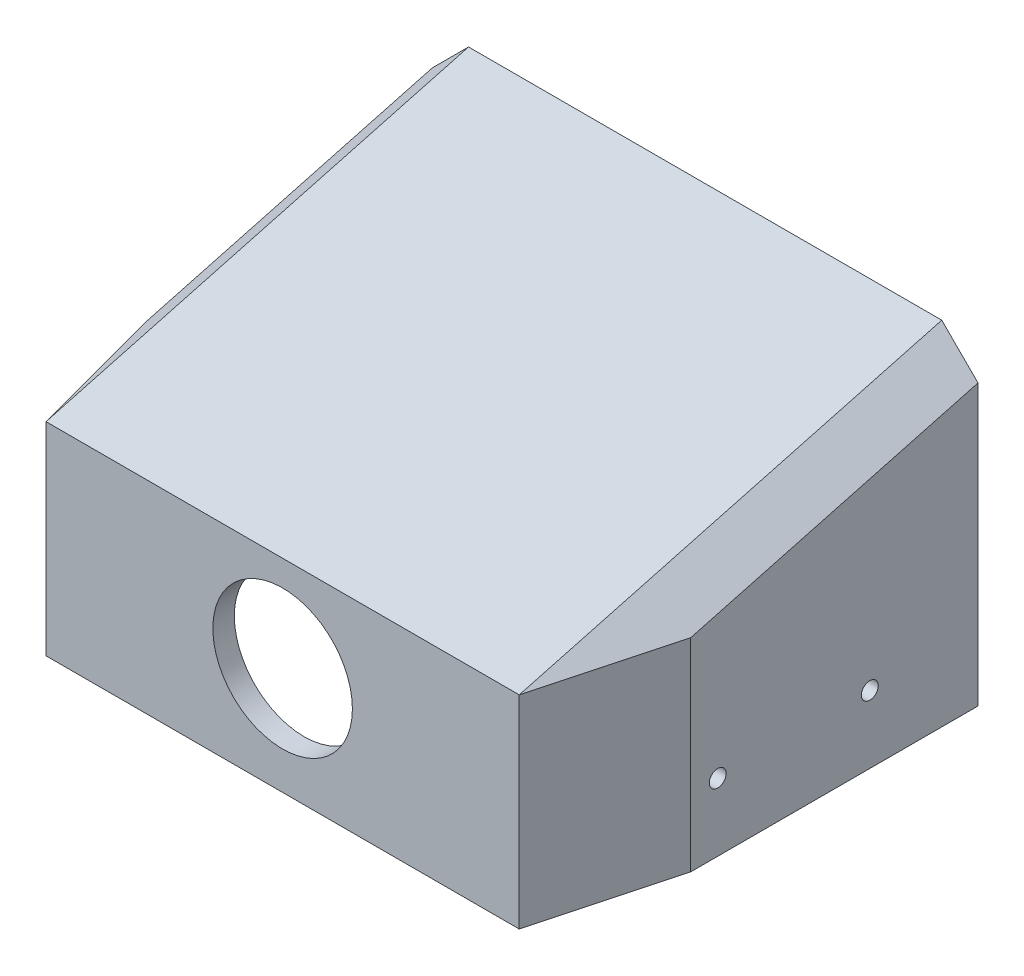
ISO-10303-21;
HEADER;
FILE_DESCRIPTION(('STEP AP214'),'2;1');
FILE_NAME('part.step','',(''),(''),'','','');
FILE_SCHEMA(('AUTOMOTIVE_DESIGN { 1 0 10303 214 1 1 1 1 }'));
ENDSEC;
DATA;
#1=APPLICATION_CONTEXT('core data for automotive mechanical design processes');
#2=APPLICATION_PROTOCOL_DEFINITION('international standard','automotive_design',2000,#1);
#3=PRODUCT_CONTEXT('',#1,'mechanical');
#4=PRODUCT('Part','Part','',(#3));
#5=PRODUCT_RELATED_PRODUCT_CATEGORY('part','',(#4));
#6=PRODUCT_DEFINITION_FORMATION('','',#4);
#7=PRODUCT_DEFINITION_CONTEXT('part definition',#1,'design');
#8=PRODUCT_DEFINITION('design','',#6,#7);
#9=PRODUCT_DEFINITION_SHAPE('','',#8);
#10=(LENGTH_UNIT() NAMED_UNIT(*) SI_UNIT(.MILLI.,.METRE.));
#11=(NAMED_UNIT(*) PLANE_ANGLE_UNIT() SI_UNIT($,.RADIAN.));
#12=(NAMED_UNIT(*) SI_UNIT($,.STERADIAN.) SOLID_ANGLE_UNIT());
#13=UNCERTAINTY_MEASURE_WITH_UNIT(LENGTH_MEASURE(1.E-05),#10,'distance_accuracy_value','');
#14=(GEOMETRIC_REPRESENTATION_CONTEXT(3) GLOBAL_UNCERTAINTY_ASSIGNED_CONTEXT((#13)) GLOBAL_UNIT_ASSIGNED_CONTEXT((#10,
#11,#12)) REPRESENTATION_CONTEXT('',''));
#15=CARTESIAN_POINT('',(0.,0.,0.));
#16=DIRECTION('',(0.,0.,1.));
#17=DIRECTION('',(1.,0.,0.));
#18=AXIS2_PLACEMENT_3D('',#15,#16,#17);
#19=CARTESIAN_POINT('',(103.493649053891,60.,-62.5));
#20=DIRECTION('',(-0.965925826289067,0.,-0.258819045102524));
#21=DIRECTION('',(-0.258819045102524,0.,0.965925826289067));
#22=AXIS2_PLACEMENT_3D('',#19,#20,#21);
#23=PLANE('',#22);
#24=DIRECTION('',(0.258819045102524,0.,-0.965925826289067));
#25=VECTOR('',#24,1.);
#26=CARTESIAN_POINT('',(103.493649053891,0.,-62.5));
#27=LINE('',#26,#25);
#28=CARTESIAN_POINT('',(70.,0.,62.5));
#29=VERTEX_POINT('',#28);
#30=CARTESIAN_POINT('',(80.7179676972451,0.,22.5));
#31=VERTEX_POINT('',#30);
#32=EDGE_CURVE('E225',#29,#31,#27,.T.);
#33=ORIENTED_EDGE('',*,*,#32,.T.);
#34=DIRECTION('',(0.,1.,0.));
#35=VECTOR('',#34,1.);
#36=CARTESIAN_POINT('',(80.7179676972451,0.,22.5));
#37=LINE('',#36,#35);
#38=CARTESIAN_POINT('',(80.7179676972451,60.,22.5));
#39=VERTEX_POINT('',#38);
#40=EDGE_CURVE('E176',#31,#39,#37,.T.);
#41=ORIENTED_EDGE('',*,*,#40,.T.);
#42=DIRECTION('',(0.258819045102524,0.,-0.965925826289067));
#43=VECTOR('',#42,1.);
#44=CARTESIAN_POINT('',(103.493649053891,60.,-62.5));
#45=LINE('',#44,#43);
#46=CARTESIAN_POINT('',(70.,60.,62.5));
#47=VERTEX_POINT('',#46);
#48=EDGE_CURVE('E226',#47,#39,#45,.T.);
#49=ORIENTED_EDGE('',*,*,#48,.F.);
#50=DIRECTION('',(0.,-1.,0.));
#51=VECTOR('',#50,1.);
#52=CARTESIAN_POINT('',(70.,60.,62.5));
#53=LINE('',#52,#51);
#54=EDGE_CURVE('E235',#47,#29,#53,.T.);
#55=ORIENTED_EDGE('',*,*,#54,.T.);
#56=EDGE_LOOP('',(#33,#41,#49,#55));
#57=FACE_BOUND('',#56,.T.);
#58=ADVANCED_FACE('F37',(#57),#23,.F.);
#59=CARTESIAN_POINT('',(-103.493649053891,60.,-62.5));
#60=DIRECTION('',(0.,0.,1.));
#61=DIRECTION('',(1.,0.,0.));
#62=AXIS2_PLACEMENT_3D('',#59,#60,#61);
#63=PLANE('',#62);
#64=CARTESIAN_POINT('',(0.,31.75,-62.5));
#65=DIRECTION('',(0.,0.,-1.));
#66=DIRECTION('',(-1.,0.,0.));
#67=AXIS2_PLACEMENT_3D('',#64,#65,#66);
#68=CIRCLE('',#67,20.64);
#69=CARTESIAN_POINT('',(-20.64,31.75,-62.5));
#70=VERTEX_POINT('',#69);
#71=EDGE_CURVE('E252',#70,#70,#68,.T.);
#72=ORIENTED_EDGE('',*,*,#71,.F.);
#73=EDGE_LOOP('',(#72));
#74=FACE_BOUND('',#73,.T.);
#75=DIRECTION('',(-1.,0.,0.));
#76=VECTOR('',#75,1.);
#77=CARTESIAN_POINT('',(-103.493649053891,0.,-62.5));
#78=LINE('',#77,#76);
#79=CARTESIAN_POINT('',(80.7179676972451,0.,-62.5));
#80=VERTEX_POINT('',#79);
#81=CARTESIAN_POINT('',(-80.7179676972451,0.,-62.5));
#82=VERTEX_POINT('',#81);
#83=EDGE_CURVE('E238',#80,#82,#78,.T.);
#84=ORIENTED_EDGE('',*,*,#83,.T.);
#85=DIRECTION('',(0.,1.,0.));
#86=VECTOR('',#85,1.);
#87=CARTESIAN_POINT('',(-80.7179676972451,60.,-62.5));
#88=LINE('',#87,#86);
#89=CARTESIAN_POINT('',(-80.7179676972451,82.7756813566449,-62.5));
#90=VERTEX_POINT('',#89);
#91=EDGE_CURVE('E205',#82,#90,#88,.T.);
#92=ORIENTED_EDGE('',*,*,#91,.T.);
#93=DIRECTION('',(0.707106781186562,0.707106781186533,0.));
#94=VECTOR('',#93,1.);
#95=CARTESIAN_POINT('',(-103.493649053891,60.,-62.5));
#96=LINE('',#95,#94);
#97=CARTESIAN_POINT('',(-70.,93.4936490538895,-62.5));
#98=VERTEX_POINT('',#97);
#99=EDGE_CURVE('E212',#90,#98,#96,.T.);
#100=ORIENTED_EDGE('',*,*,#99,.T.);
#101=DIRECTION('',(-1.,0.,0.));
#102=VECTOR('',#101,1.);
#103=CARTESIAN_POINT('',(70.,93.4936490538895,-62.5));
#104=LINE('',#103,#102);
#105=CARTESIAN_POINT('',(70.,93.4936490538895,-62.4999999999999));
#106=VERTEX_POINT('',#105);
#107=EDGE_CURVE('E222',#106,#98,#104,.T.);
#108=ORIENTED_EDGE('',*,*,#107,.F.);
#109=DIRECTION('',(0.707106781186562,-0.707106781186533,0.));
#110=VECTOR('',#109,1.);
#111=CARTESIAN_POINT('',(103.493649053891,60.,-62.5));
#112=LINE('',#111,#110);
#113=CARTESIAN_POINT('',(80.7179676972451,82.7756813566448,-62.5));
#114=VERTEX_POINT('',#113);
#115=EDGE_CURVE('E214',#106,#114,#112,.T.);
#116=ORIENTED_EDGE('',*,*,#115,.T.);
#117=DIRECTION('',(0.,-1.,0.));
#118=VECTOR('',#117,1.);
#119=CARTESIAN_POINT('',(80.7179676972451,60.,-62.5));
#120=LINE('',#119,#118);
#121=EDGE_CURVE('E60',#114,#80,#120,.T.);
#122=ORIENTED_EDGE('',*,*,#121,.T.);
#123=EDGE_LOOP('',(#84,#92,#100,#108,#116,#122));
#124=FACE_BOUND('',#123,.T.);
#125=ADVANCED_FACE('F338',(#74,#124),#63,.F.);
#126=CARTESIAN_POINT('',(-103.493649053891,60.,-62.5));
#127=DIRECTION('',(0.965925826289067,0.,-0.258819045102524));
#128=DIRECTION('',(-0.258819045102524,0.,-0.965925826289067));
#129=AXIS2_PLACEMENT_3D('',#126,#127,#128);
#130=PLANE('',#129);
#131=DIRECTION('',(0.258819045102524,0.,0.965925826289067));
#132=VECTOR('',#131,1.);
#133=CARTESIAN_POINT('',(-103.493649053891,60.,-62.5));
#134=LINE('',#133,#132);
#135=CARTESIAN_POINT('',(-80.7179676972451,60.,22.5000000000001));
#136=VERTEX_POINT('',#135);
#137=CARTESIAN_POINT('',(-70.,60.,62.5));
#138=VERTEX_POINT('',#137);
#139=EDGE_CURVE('E229',#136,#138,#134,.T.);
#140=ORIENTED_EDGE('',*,*,#139,.F.);
#141=DIRECTION('',(0.,1.,0.));
#142=VECTOR('',#141,1.);
#143=CARTESIAN_POINT('',(-80.7179676972451,0.,22.5));
#144=LINE('',#143,#142);
#145=CARTESIAN_POINT('',(-80.7179676972451,0.,22.5));
#146=VERTEX_POINT('',#145);
#147=EDGE_CURVE('E204',#146,#136,#144,.T.);
#148=ORIENTED_EDGE('',*,*,#147,.F.);
#149=DIRECTION('',(0.258819045102524,0.,0.965925826289067));
#150=VECTOR('',#149,1.);
#151=CARTESIAN_POINT('',(-103.493649053891,0.,-62.5));
#152=LINE('',#151,#150);
#153=CARTESIAN_POINT('',(-70.,0.,62.5));
#154=VERTEX_POINT('',#153);
#155=EDGE_CURVE('E241',#146,#154,#152,.T.);
#156=ORIENTED_EDGE('',*,*,#155,.T.);
#157=DIRECTION('',(0.,-1.,0.));
#158=VECTOR('',#157,1.);
#159=CARTESIAN_POINT('',(-70.,60.,62.5));
#160=LINE('',#159,#158);
#161=EDGE_CURVE('E246',#138,#154,#160,.T.);
#162=ORIENTED_EDGE('',*,*,#161,.F.);
#163=EDGE_LOOP('',(#140,#148,#156,#162));
#164=FACE_BOUND('',#163,.T.);
#165=ADVANCED_FACE('F343',(#164),#130,.F.);
#166=CARTESIAN_POINT('',(70.,60.,62.5));
#167=DIRECTION('',(0.,0.,-1.));
#168=DIRECTION('',(-1.,0.,0.));
#169=AXIS2_PLACEMENT_3D('',#166,#167,#168);
#170=PLANE('',#169);
#171=CARTESIAN_POINT('',(0.,31.75,62.5));
#172=DIRECTION('',(0.,0.,1.));
#173=DIRECTION('',(1.,0.,0.));
#174=AXIS2_PLACEMENT_3D('',#171,#172,#173);
#175=CIRCLE('',#174,20.64);
#176=CARTESIAN_POINT('',(20.64,31.75,62.5));
#177=VERTEX_POINT('',#176);
#178=EDGE_CURVE('E255',#177,#177,#175,.T.);
#179=ORIENTED_EDGE('',*,*,#178,.F.);
#180=EDGE_LOOP('',(#179));
#181=FACE_BOUND('',#180,.T.);
#182=DIRECTION('',(1.,0.,0.));
#183=VECTOR('',#182,1.);
#184=CARTESIAN_POINT('',(70.,0.,62.5));
#185=LINE('',#184,#183);
#186=EDGE_CURVE('E230',#154,#29,#185,.T.);
#187=ORIENTED_EDGE('',*,*,#186,.T.);
#188=ORIENTED_EDGE('',*,*,#54,.F.);
#189=DIRECTION('',(1.,0.,0.));
#190=VECTOR('',#189,1.);
#191=CARTESIAN_POINT('',(70.,60.,62.5));
#192=LINE('',#191,#190);
#193=EDGE_CURVE('E232',#138,#47,#192,.T.);
#194=ORIENTED_EDGE('',*,*,#193,.F.);
#195=ORIENTED_EDGE('',*,*,#161,.T.);
#196=EDGE_LOOP('',(#187,#188,#194,#195));
#197=FACE_BOUND('',#196,.T.);
#198=ADVANCED_FACE('F362',(#181,#197),#170,.F.);
#199=CARTESIAN_POINT('',(0.,0.,0.));
#200=DIRECTION('',(0.,-1.,0.));
#201=DIRECTION('',(0.,0.,-1.));
#202=AXIS2_PLACEMENT_3D('',#199,#200,#201);
#203=PLANE('',#202);
#204=DIRECTION('',(0.,0.,-1.));
#205=VECTOR('',#204,1.);
#206=CARTESIAN_POINT('',(-74.3679676972451,0.,22.5));
#207=LINE('',#206,#205);
#208=CARTESIAN_POINT('',(-74.3679676972451,0.,21.6640066403199));
#209=VERTEX_POINT('',#208);
#210=CARTESIAN_POINT('',(-74.3679676972451,0.,-56.15));
#211=VERTEX_POINT('',#210);
#212=EDGE_CURVE('E190',#209,#211,#207,.T.);
#213=ORIENTED_EDGE('',*,*,#212,.F.);
#214=DIRECTION('',(0.258819045102524,0.,0.965925826289067));
#215=VECTOR('',#214,1.);
#216=CARTESIAN_POINT('',(-74.8022601355199,0.,20.0432051953356));
#217=LINE('',#216,#215);
#218=CARTESIAN_POINT('',(-65.1274736263336,0.,56.15));
#219=VERTEX_POINT('',#218);
#220=EDGE_CURVE('E187',#209,#219,#217,.T.);
#221=ORIENTED_EDGE('',*,*,#220,.T.);
#222=DIRECTION('',(1.,0.,0.));
#223=VECTOR('',#222,1.);
#224=CARTESIAN_POINT('',(0.,0.,56.15));
#225=LINE('',#224,#223);
#226=CARTESIAN_POINT('',(65.1274736263336,0.,56.15));
#227=VERTEX_POINT('',#226);
#228=EDGE_CURVE('E53',#219,#227,#225,.T.);
#229=ORIENTED_EDGE('',*,*,#228,.T.);
#230=DIRECTION('',(0.258819045102524,0.,-0.965925826289067));
#231=VECTOR('',#230,1.);
#232=CARTESIAN_POINT('',(74.8022601355199,0.,20.0432051953356));
#233=LINE('',#232,#231);
#234=CARTESIAN_POINT('',(74.3679676972451,0.,21.6640066403199));
#235=VERTEX_POINT('',#234);
#236=EDGE_CURVE('E182',#227,#235,#233,.T.);
#237=ORIENTED_EDGE('',*,*,#236,.T.);
#238=DIRECTION('',(0.,0.,1.));
#239=VECTOR('',#238,1.);
#240=CARTESIAN_POINT('',(74.3679676972451,0.,22.5));
#241=LINE('',#240,#239);
#242=CARTESIAN_POINT('',(74.3679676972451,0.,-56.15));
#243=VERTEX_POINT('',#242);
#244=EDGE_CURVE('E197',#243,#235,#241,.T.);
#245=ORIENTED_EDGE('',*,*,#244,.F.);
#246=DIRECTION('',(-1.,0.,0.));
#247=VECTOR('',#246,1.);
#248=CARTESIAN_POINT('',(0.,0.,-56.15));
#249=LINE('',#248,#247);
#250=EDGE_CURVE('E185',#243,#211,#249,.T.);
#251=ORIENTED_EDGE('',*,*,#250,.T.);
#252=EDGE_LOOP('',(#213,#221,#229,#237,#245,#251));
#253=FACE_BOUND('',#252,.T.);
#254=DIRECTION('',(0.,0.,-1.));
#255=VECTOR('',#254,1.);
#256=CARTESIAN_POINT('',(-80.7179676972451,0.,22.5));
#257=LINE('',#256,#255);
#258=EDGE_CURVE('E201',#146,#82,#257,.T.);
#259=ORIENTED_EDGE('',*,*,#258,.T.);
#260=ORIENTED_EDGE('',*,*,#83,.F.);
#261=DIRECTION('',(0.,0.,1.));
#262=VECTOR('',#261,1.);
#263=CARTESIAN_POINT('',(80.7179676972451,0.,22.5));
#264=LINE('',#263,#262);
#265=EDGE_CURVE('E172',#80,#31,#264,.T.);
#266=ORIENTED_EDGE('',*,*,#265,.T.);
#267=ORIENTED_EDGE('',*,*,#32,.F.);
#268=ORIENTED_EDGE('',*,*,#186,.F.);
#269=ORIENTED_EDGE('',*,*,#155,.F.);
#270=EDGE_LOOP('',(#259,#260,#266,#267,#268,#269));
#271=FACE_BOUND('',#270,.T.);
#272=ADVANCED_FACE('F321',(#253,#271),#203,.T.);
#273=CARTESIAN_POINT('',(70.,60.,62.5));
#274=DIRECTION('',(0.,-0.96592582628907,-0.258819045102515));
#275=DIRECTION('',(0.,0.258819045102515,-0.96592582628907));
#276=AXIS2_PLACEMENT_3D('',#273,#274,#275);
#277=PLANE('',#276);
#278=ORIENTED_EDGE('',*,*,#107,.T.);
#279=DIRECTION('',(0.,-0.258819045102515,0.96592582628907));
#280=VECTOR('',#279,1.);
#281=CARTESIAN_POINT('',(-70.,60.,62.5));
#282=LINE('',#281,#280);
#283=EDGE_CURVE('E217',#98,#138,#282,.T.);
#284=ORIENTED_EDGE('',*,*,#283,.T.);
#285=ORIENTED_EDGE('',*,*,#193,.T.);
#286=DIRECTION('',(0.,-0.258819045102515,0.96592582628907));
#287=VECTOR('',#286,1.);
#288=CARTESIAN_POINT('',(70.,60.,62.5));
#289=LINE('',#288,#287);
#290=EDGE_CURVE('E220',#106,#47,#289,.T.);
#291=ORIENTED_EDGE('',*,*,#290,.F.);
#292=EDGE_LOOP('',(#278,#284,#285,#291));
#293=FACE_BOUND('',#292,.T.);
#294=ADVANCED_FACE('F358',(#293),#277,.F.);
#295=CARTESIAN_POINT('',(70.8307043776579,70.8307043776608,18.9790300373213));
#296=DIRECTION('',(0.694746590606852,0.69474659060688,0.186156787897385));
#297=DIRECTION('',(-0.707106781186562,0.707106781186533,0.));
#298=AXIS2_PLACEMENT_3D('',#295,#296,#297);
#299=PLANE('',#298);
#300=DIRECTION('',(0.,-0.258819045102515,0.96592582628907));
#301=VECTOR('',#300,1.);
#302=CARTESIAN_POINT('',(80.7179676972451,61.6057621135332,16.5072142074247));
#303=LINE('',#302,#301);
#304=EDGE_CURVE('E11',#114,#39,#303,.T.);
#305=ORIENTED_EDGE('',*,*,#304,.F.);
#306=ORIENTED_EDGE('',*,*,#115,.F.);
#307=ORIENTED_EDGE('',*,*,#290,.T.);
#308=ORIENTED_EDGE('',*,*,#48,.T.);
#309=EDGE_LOOP('',(#305,#306,#307,#308));
#310=FACE_BOUND('',#309,.T.);
#311=ADVANCED_FACE('F356',(#310),#299,.T.);
#312=CARTESIAN_POINT('',(-70.8307043776579,70.8307043776608,18.9790300373213));
#313=DIRECTION('',(-0.694746590606852,0.69474659060688,0.186156787897385));
#314=DIRECTION('',(-0.707106781186562,-0.707106781186533,0.));
#315=AXIS2_PLACEMENT_3D('',#312,#313,#314);
#316=PLANE('',#315);
#317=DIRECTION('',(0.,0.258819045102515,-0.96592582628907));
#318=VECTOR('',#317,1.);
#319=CARTESIAN_POINT('',(-80.7179676972451,61.6057621135333,16.5072142074247));
#320=LINE('',#319,#318);
#321=EDGE_CURVE('E45',#136,#90,#320,.T.);
#322=ORIENTED_EDGE('',*,*,#321,.F.);
#323=ORIENTED_EDGE('',*,*,#139,.T.);
#324=ORIENTED_EDGE('',*,*,#283,.F.);
#325=ORIENTED_EDGE('',*,*,#99,.F.);
#326=EDGE_LOOP('',(#322,#323,#324,#325));
#327=FACE_BOUND('',#326,.T.);
#328=ADVANCED_FACE('F372',(#327),#316,.T.);
#329=CARTESIAN_POINT('',(-80.7179676972451,0.,22.5));
#330=DIRECTION('',(1.,0.,0.));
#331=DIRECTION('',(0.,0.,-1.));
#332=AXIS2_PLACEMENT_3D('',#329,#330,#331);
#333=PLANE('',#332);
#334=CARTESIAN_POINT('',(-80.7179676972451,20.,14.5));
#335=DIRECTION('',(1.,0.,0.));
#336=DIRECTION('',(0.,0.,-1.));
#337=AXIS2_PLACEMENT_3D('',#334,#335,#336);
#338=CIRCLE('',#337,2.5);
#339=CARTESIAN_POINT('',(-80.7179676972451,20.,12.));
#340=VERTEX_POINT('',#339);
#341=EDGE_CURVE('E259',#340,#340,#338,.T.);
#342=ORIENTED_EDGE('',*,*,#341,.T.);
#343=EDGE_LOOP('',(#342));
#344=FACE_BOUND('',#343,.T.);
#345=CARTESIAN_POINT('',(-80.7179676972451,20.,-30.5));
#346=DIRECTION('',(1.,0.,0.));
#347=DIRECTION('',(0.,0.,-1.));
#348=AXIS2_PLACEMENT_3D('',#345,#346,#347);
#349=CIRCLE('',#348,2.5);
#350=CARTESIAN_POINT('',(-80.7179676972451,20.,-33.));
#351=VERTEX_POINT('',#350);
#352=EDGE_CURVE('E270',#351,#351,#349,.T.);
#353=ORIENTED_EDGE('',*,*,#352,.T.);
#354=EDGE_LOOP('',(#353));
#355=FACE_BOUND('',#354,.T.);
#356=ORIENTED_EDGE('',*,*,#258,.F.);
#357=ORIENTED_EDGE('',*,*,#147,.T.);
#358=ORIENTED_EDGE('',*,*,#321,.T.);
#359=ORIENTED_EDGE('',*,*,#91,.F.);
#360=EDGE_LOOP('',(#356,#357,#358,#359));
#361=FACE_BOUND('',#360,.T.);
#362=ADVANCED_FACE('F368',(#344,#355,#361),#333,.F.);
#363=CARTESIAN_POINT('',(80.7179676972451,0.,22.5));
#364=DIRECTION('',(-1.,0.,0.));
#365=DIRECTION('',(0.,0.,1.));
#366=AXIS2_PLACEMENT_3D('',#363,#364,#365);
#367=PLANE('',#366);
#368=CARTESIAN_POINT('',(80.7179676972451,20.,14.5));
#369=DIRECTION('',(1.,0.,0.));
#370=DIRECTION('',(0.,0.,-1.));
#371=AXIS2_PLACEMENT_3D('',#368,#369,#370);
#372=CIRCLE('',#371,2.5);
#373=CARTESIAN_POINT('',(80.7179676972451,20.,12.));
#374=VERTEX_POINT('',#373);
#375=EDGE_CURVE('E265',#374,#374,#372,.T.);
#376=ORIENTED_EDGE('',*,*,#375,.F.);
#377=EDGE_LOOP('',(#376));
#378=FACE_BOUND('',#377,.T.);
#379=CARTESIAN_POINT('',(80.7179676972451,20.,-30.5));
#380=DIRECTION('',(1.,0.,0.));
#381=DIRECTION('',(0.,0.,-1.));
#382=AXIS2_PLACEMENT_3D('',#379,#380,#381);
#383=CIRCLE('',#382,2.5);
#384=CARTESIAN_POINT('',(80.7179676972451,20.,-33.));
#385=VERTEX_POINT('',#384);
#386=EDGE_CURVE('E273',#385,#385,#383,.T.);
#387=ORIENTED_EDGE('',*,*,#386,.F.);
#388=EDGE_LOOP('',(#387));
#389=FACE_BOUND('',#388,.T.);
#390=ORIENTED_EDGE('',*,*,#304,.T.);
#391=ORIENTED_EDGE('',*,*,#40,.F.);
#392=ORIENTED_EDGE('',*,*,#265,.F.);
#393=ORIENTED_EDGE('',*,*,#121,.F.);
#394=EDGE_LOOP('',(#390,#391,#392,#393));
#395=FACE_BOUND('',#394,.T.);
#396=ADVANCED_FACE('F351',(#378,#389,#395),#367,.F.);
#397=CARTESIAN_POINT('',(97.3600200569553,60.,-64.143500936401));
#398=DIRECTION('',(-0.965925826289067,0.,-0.258819045102524));
#399=DIRECTION('',(-0.258819045102524,0.,0.965925826289067));
#400=AXIS2_PLACEMENT_3D('',#397,#398,#399);
#401=PLANE('',#400);
#402=ORIENTED_EDGE('',*,*,#236,.F.);
#403=DIRECTION('',(0.,-1.,0.));
#404=VECTOR('',#403,1.);
#405=CARTESIAN_POINT('',(65.1274736263336,60.,56.15));
#406=LINE('',#405,#404);
#407=CARTESIAN_POINT('',(65.1274736263336,55.1274736263336,56.15));
#408=VERTEX_POINT('',#407);
#409=EDGE_CURVE('E170',#408,#227,#406,.T.);
#410=ORIENTED_EDGE('',*,*,#409,.F.);
#411=DIRECTION('',(0.250562807085736,0.250562807085725,-0.93511312653103));
#412=VECTOR('',#411,1.);
#413=CARTESIAN_POINT('',(64.2514507831414,54.2514507831414,59.4193617593843));
#414=LINE('',#413,#412);
#415=CARTESIAN_POINT('',(67.4339804826569,57.4339804826568,47.5419992241956));
#416=VERTEX_POINT('',#415);
#417=EDGE_CURVE('E161',#408,#416,#414,.T.);
#418=ORIENTED_EDGE('',*,*,#417,.T.);
#419=DIRECTION('',(0.258819045102524,0.,-0.965925826289067));
#420=VECTOR('',#419,1.);
#421=CARTESIAN_POINT('',(97.3600200569553,57.4339804826568,-64.143500936401));
#422=LINE('',#421,#420);
#423=CARTESIAN_POINT('',(74.3679676972451,57.4339804826568,21.6640066403199));
#424=VERTEX_POINT('',#423);
#425=EDGE_CURVE('E145',#416,#424,#422,.T.);
#426=ORIENTED_EDGE('',*,*,#425,.T.);
#427=DIRECTION('',(0.,1.,0.));
#428=VECTOR('',#427,1.);
#429=CARTESIAN_POINT('',(74.3679676972451,60.,21.6640066403199));
#430=LINE('',#429,#428);
#431=EDGE_CURVE('E194',#235,#424,#430,.T.);
#432=ORIENTED_EDGE('',*,*,#431,.F.);
#433=EDGE_LOOP('',(#402,#410,#418,#426,#432));
#434=FACE_BOUND('',#433,.T.);
#435=ADVANCED_FACE('F169',(#434),#401,.T.);
#436=CARTESIAN_POINT('',(-103.493649053891,60.,-56.15));
#437=DIRECTION('',(0.,0.,1.));
#438=DIRECTION('',(1.,0.,0.));
#439=AXIS2_PLACEMENT_3D('',#436,#437,#438);
#440=PLANE('',#439);
#441=CARTESIAN_POINT('',(0.,31.75,-56.15));
#442=DIRECTION('',(0.,0.,1.));
#443=DIRECTION('',(1.,0.,0.));
#444=AXIS2_PLACEMENT_3D('',#441,#442,#443);
#445=CIRCLE('',#444,20.64);
#446=CARTESIAN_POINT('',(20.64,31.75,-56.15));
#447=VERTEX_POINT('',#446);
#448=EDGE_CURVE('E200',#447,#447,#445,.T.);
#449=ORIENTED_EDGE('',*,*,#448,.F.);
#450=EDGE_LOOP('',(#449));
#451=FACE_BOUND('',#450,.T.);
#452=ORIENTED_EDGE('',*,*,#250,.F.);
#453=DIRECTION('',(0.,-1.,0.));
#454=VECTOR('',#453,1.);
#455=CARTESIAN_POINT('',(74.3679676972451,60.,-56.15));
#456=LINE('',#455,#454);
#457=CARTESIAN_POINT('',(74.3679676972451,78.28418072176,-56.15));
#458=VERTEX_POINT('',#457);
#459=EDGE_CURVE('E301',#458,#243,#456,.T.);
#460=ORIENTED_EDGE('',*,*,#459,.F.);
#461=DIRECTION('',(0.707106781186562,-0.707106781186533,0.));
#462=VECTOR('',#461,1.);
#463=CARTESIAN_POINT('',(76.326074209501,76.3260742095042,-56.15));
#464=LINE('',#463,#462);
#465=CARTESIAN_POINT('',(67.4339804826569,85.2181679363479,-56.15));
#466=VERTEX_POINT('',#465);
#467=EDGE_CURVE('E297',#466,#458,#464,.T.);
#468=ORIENTED_EDGE('',*,*,#467,.F.);
#469=DIRECTION('',(-1.,0.,0.));
#470=VECTOR('',#469,1.);
#471=CARTESIAN_POINT('',(70.,85.2181679363479,-56.15));
#472=LINE('',#471,#470);
#473=CARTESIAN_POINT('',(-67.433980482657,85.2181679363479,-56.15));
#474=VERTEX_POINT('',#473);
#475=EDGE_CURVE('E165',#466,#474,#472,.T.);
#476=ORIENTED_EDGE('',*,*,#475,.T.);
#477=DIRECTION('',(0.707106781186562,0.707106781186533,0.));
#478=VECTOR('',#477,1.);
#479=CARTESIAN_POINT('',(-76.3260742095011,76.3260742095042,-56.15));
#480=LINE('',#479,#478);
#481=CARTESIAN_POINT('',(-74.3679676972451,78.28418072176,-56.15));
#482=VERTEX_POINT('',#481);
#483=EDGE_CURVE('E302',#482,#474,#480,.T.);
#484=ORIENTED_EDGE('',*,*,#483,.F.);
#485=DIRECTION('',(0.,1.,0.));
#486=VECTOR('',#485,1.);
#487=CARTESIAN_POINT('',(-74.3679676972451,60.,-56.15));
#488=LINE('',#487,#486);
#489=EDGE_CURVE('E295',#211,#482,#488,.T.);
#490=ORIENTED_EDGE('',*,*,#489,.F.);
#491=EDGE_LOOP('',(#452,#460,#468,#476,#484,#490));
#492=FACE_BOUND('',#491,.T.);
#493=ADVANCED_FACE('F316',(#451,#492),#440,.T.);
#494=CARTESIAN_POINT('',(-97.3600200569553,60.,-64.143500936401));
#495=DIRECTION('',(0.965925826289067,0.,-0.258819045102524));
#496=DIRECTION('',(-0.258819045102524,0.,-0.965925826289067));
#497=AXIS2_PLACEMENT_3D('',#494,#495,#496);
#498=PLANE('',#497);
#499=DIRECTION('',(0.258819045102524,0.,0.965925826289067));
#500=VECTOR('',#499,1.);
#501=CARTESIAN_POINT('',(-97.3600200569553,57.4339804826569,-64.143500936401));
#502=LINE('',#501,#500);
#503=CARTESIAN_POINT('',(-74.3679676972451,57.4339804826568,21.6640066403199));
#504=VERTEX_POINT('',#503);
#505=CARTESIAN_POINT('',(-67.433980482657,57.4339804826568,47.5419992241953));
#506=VERTEX_POINT('',#505);
#507=EDGE_CURVE('E156',#504,#506,#502,.T.);
#508=ORIENTED_EDGE('',*,*,#507,.T.);
#509=DIRECTION('',(-0.250562807085736,0.250562807085725,-0.93511312653103));
#510=VECTOR('',#509,1.);
#511=CARTESIAN_POINT('',(-95.6423109304827,85.6423109304814,-57.7329232037808));
#512=LINE('',#511,#510);
#513=CARTESIAN_POINT('',(-65.1274736263336,55.1274736263336,56.15));
#514=VERTEX_POINT('',#513);
#515=EDGE_CURVE('E173',#514,#506,#512,.T.);
#516=ORIENTED_EDGE('',*,*,#515,.F.);
#517=DIRECTION('',(0.,-1.,0.));
#518=VECTOR('',#517,1.);
#519=CARTESIAN_POINT('',(-65.1274736263336,60.,56.15));
#520=LINE('',#519,#518);
#521=EDGE_CURVE('E287',#514,#219,#520,.T.);
#522=ORIENTED_EDGE('',*,*,#521,.T.);
#523=ORIENTED_EDGE('',*,*,#220,.F.);
#524=DIRECTION('',(0.,1.,0.));
#525=VECTOR('',#524,1.);
#526=CARTESIAN_POINT('',(-74.3679676972451,0.,21.6640066403199));
#527=LINE('',#526,#525);
#528=EDGE_CURVE('E193',#209,#504,#527,.T.);
#529=ORIENTED_EDGE('',*,*,#528,.T.);
#530=EDGE_LOOP('',(#508,#516,#522,#523,#529));
#531=FACE_BOUND('',#530,.T.);
#532=ADVANCED_FACE('F325',(#531),#498,.T.);
#533=CARTESIAN_POINT('',(70.,60.,56.15));
#534=DIRECTION('',(0.,0.,-1.));
#535=DIRECTION('',(-1.,0.,0.));
#536=AXIS2_PLACEMENT_3D('',#533,#534,#535);
#537=PLANE('',#536);
#538=CARTESIAN_POINT('',(0.,31.75,56.15));
#539=DIRECTION('',(0.,0.,-1.));
#540=DIRECTION('',(-1.,0.,0.));
#541=AXIS2_PLACEMENT_3D('',#538,#539,#540);
#542=CIRCLE('',#541,20.64);
#543=CARTESIAN_POINT('',(-20.64,31.75,56.15));
#544=VERTEX_POINT('',#543);
#545=EDGE_CURVE('E253',#544,#544,#542,.T.);
#546=ORIENTED_EDGE('',*,*,#545,.F.);
#547=EDGE_LOOP('',(#546));
#548=FACE_BOUND('',#547,.T.);
#549=ORIENTED_EDGE('',*,*,#228,.F.);
#550=ORIENTED_EDGE('',*,*,#521,.F.);
#551=DIRECTION('',(1.,0.,0.));
#552=VECTOR('',#551,1.);
#553=CARTESIAN_POINT('',(70.,55.1274736263336,56.15));
#554=LINE('',#553,#552);
#555=EDGE_CURVE('E288',#514,#408,#554,.T.);
#556=ORIENTED_EDGE('',*,*,#555,.T.);
#557=ORIENTED_EDGE('',*,*,#409,.T.);
#558=EDGE_LOOP('',(#549,#550,#556,#557));
#559=FACE_BOUND('',#558,.T.);
#560=ADVANCED_FACE('F326',(#548,#559),#537,.T.);
#561=CARTESIAN_POINT('',(70.,53.8663710030644,60.856499063599));
#562=DIRECTION('',(0.,-0.96592582628907,-0.258819045102515));
#563=DIRECTION('',(0.,0.258819045102515,-0.96592582628907));
#564=AXIS2_PLACEMENT_3D('',#561,#562,#563);
#565=PLANE('',#564);
#566=ORIENTED_EDGE('',*,*,#475,.F.);
#567=DIRECTION('',(0.,-0.258819045102515,0.96592582628907));
#568=VECTOR('',#567,1.);
#569=CARTESIAN_POINT('',(67.4339804826569,53.8663710030644,60.856499063599));
#570=LINE('',#569,#568);
#571=EDGE_CURVE('E149',#466,#416,#570,.T.);
#572=ORIENTED_EDGE('',*,*,#571,.T.);
#573=ORIENTED_EDGE('',*,*,#417,.F.);
#574=ORIENTED_EDGE('',*,*,#555,.F.);
#575=ORIENTED_EDGE('',*,*,#515,.T.);
#576=DIRECTION('',(0.,-0.258819045102515,0.96592582628907));
#577=VECTOR('',#576,1.);
#578=CARTESIAN_POINT('',(-67.433980482657,65.4721331165974,17.5432051953348));
#579=LINE('',#578,#577);
#580=EDGE_CURVE('E166',#474,#506,#579,.T.);
#581=ORIENTED_EDGE('',*,*,#580,.F.);
#582=EDGE_LOOP('',(#566,#572,#573,#574,#575,#581));
#583=FACE_BOUND('',#582,.T.);
#584=ADVANCED_FACE('F159',(#583),#565,.T.);
#585=CARTESIAN_POINT('',(66.4190635273044,66.4190635273071,17.7969344341729));
#586=DIRECTION('',(0.694746590606852,0.69474659060688,0.186156787897385));
#587=DIRECTION('',(-0.707106781186562,0.707106781186533,0.));
#588=AXIS2_PLACEMENT_3D('',#585,#586,#587);
#589=PLANE('',#588);
#590=DIRECTION('',(0.,-0.258819045102515,0.96592582628907));
#591=VECTOR('',#590,1.);
#592=CARTESIAN_POINT('',(74.3679676972451,59.0026349706286,15.8097083916879));
#593=LINE('',#592,#591);
#594=EDGE_CURVE('E152',#458,#424,#593,.T.);
#595=ORIENTED_EDGE('',*,*,#594,.T.);
#596=ORIENTED_EDGE('',*,*,#425,.F.);
#597=ORIENTED_EDGE('',*,*,#571,.F.);
#598=ORIENTED_EDGE('',*,*,#467,.T.);
#599=EDGE_LOOP('',(#595,#596,#597,#598));
#600=FACE_BOUND('',#599,.T.);
#601=ADVANCED_FACE('F147',(#600),#589,.F.);
#602=CARTESIAN_POINT('',(-66.4190635273044,66.4190635273071,17.7969344341729));
#603=DIRECTION('',(-0.694746590606852,0.69474659060688,0.186156787897385));
#604=DIRECTION('',(-0.707106781186562,-0.707106781186533,0.));
#605=AXIS2_PLACEMENT_3D('',#602,#603,#604);
#606=PLANE('',#605);
#607=DIRECTION('',(0.,0.258819045102515,-0.96592582628907));
#608=VECTOR('',#607,1.);
#609=CARTESIAN_POINT('',(-74.3679676972451,59.0026349706287,15.8097083916879));
#610=LINE('',#609,#608);
#611=EDGE_CURVE('E291',#504,#482,#610,.T.);
#612=ORIENTED_EDGE('',*,*,#611,.T.);
#613=ORIENTED_EDGE('',*,*,#483,.T.);
#614=ORIENTED_EDGE('',*,*,#580,.T.);
#615=ORIENTED_EDGE('',*,*,#507,.F.);
#616=EDGE_LOOP('',(#612,#613,#614,#615));
#617=FACE_BOUND('',#616,.T.);
#618=ADVANCED_FACE('F309',(#617),#606,.F.);
#619=CARTESIAN_POINT('',(-74.3679676972451,0.,22.5));
#620=DIRECTION('',(1.,0.,0.));
#621=DIRECTION('',(0.,0.,-1.));
#622=AXIS2_PLACEMENT_3D('',#619,#620,#621);
#623=PLANE('',#622);
#624=CARTESIAN_POINT('',(-74.3679676972451,20.,14.5));
#625=DIRECTION('',(1.,0.,0.));
#626=DIRECTION('',(0.,0.,-1.));
#627=AXIS2_PLACEMENT_3D('',#624,#625,#626);
#628=CIRCLE('',#627,2.5);
#629=CARTESIAN_POINT('',(-74.3679676972451,20.,12.));
#630=VERTEX_POINT('',#629);
#631=EDGE_CURVE('E278',#630,#630,#628,.T.);
#632=ORIENTED_EDGE('',*,*,#631,.F.);
#633=EDGE_LOOP('',(#632));
#634=FACE_BOUND('',#633,.T.);
#635=CARTESIAN_POINT('',(-74.3679676972451,20.,-30.5));
#636=DIRECTION('',(1.,0.,0.));
#637=DIRECTION('',(0.,0.,-1.));
#638=AXIS2_PLACEMENT_3D('',#635,#636,#637);
#639=CIRCLE('',#638,2.5);
#640=CARTESIAN_POINT('',(-74.3679676972451,20.,-33.));
#641=VERTEX_POINT('',#640);
#642=EDGE_CURVE('E258',#641,#641,#639,.T.);
#643=ORIENTED_EDGE('',*,*,#642,.F.);
#644=EDGE_LOOP('',(#643));
#645=FACE_BOUND('',#644,.T.);
#646=ORIENTED_EDGE('',*,*,#212,.T.);
#647=ORIENTED_EDGE('',*,*,#489,.T.);
#648=ORIENTED_EDGE('',*,*,#611,.F.);
#649=ORIENTED_EDGE('',*,*,#528,.F.);
#650=EDGE_LOOP('',(#646,#647,#648,#649));
#651=FACE_BOUND('',#650,.T.);
#652=ADVANCED_FACE('F312',(#634,#645,#651),#623,.T.);
#653=CARTESIAN_POINT('',(74.3679676972451,0.,22.5));
#654=DIRECTION('',(-1.,0.,0.));
#655=DIRECTION('',(0.,0.,1.));
#656=AXIS2_PLACEMENT_3D('',#653,#654,#655);
#657=PLANE('',#656);
#658=CARTESIAN_POINT('',(74.3679676972451,20.,14.5));
#659=DIRECTION('',(-1.,0.,0.));
#660=DIRECTION('',(0.,0.,1.));
#661=AXIS2_PLACEMENT_3D('',#658,#659,#660);
#662=CIRCLE('',#661,2.5);
#663=CARTESIAN_POINT('',(74.3679676972451,20.,17.));
#664=VERTEX_POINT('',#663);
#665=EDGE_CURVE('E40',#664,#664,#662,.T.);
#666=ORIENTED_EDGE('',*,*,#665,.F.);
#667=EDGE_LOOP('',(#666));
#668=FACE_BOUND('',#667,.T.);
#669=CARTESIAN_POINT('',(74.3679676972451,20.,-30.5));
#670=DIRECTION('',(-1.,0.,0.));
#671=DIRECTION('',(0.,0.,1.));
#672=AXIS2_PLACEMENT_3D('',#669,#670,#671);
#673=CIRCLE('',#672,2.5);
#674=CARTESIAN_POINT('',(74.3679676972451,20.,-28.));
#675=VERTEX_POINT('',#674);
#676=EDGE_CURVE('E256',#675,#675,#673,.T.);
#677=ORIENTED_EDGE('',*,*,#676,.F.);
#678=EDGE_LOOP('',(#677));
#679=FACE_BOUND('',#678,.T.);
#680=ORIENTED_EDGE('',*,*,#594,.F.);
#681=ORIENTED_EDGE('',*,*,#459,.T.);
#682=ORIENTED_EDGE('',*,*,#244,.T.);
#683=ORIENTED_EDGE('',*,*,#431,.T.);
#684=EDGE_LOOP('',(#680,#681,#682,#683));
#685=FACE_BOUND('',#684,.T.);
#686=ADVANCED_FACE('F319',(#668,#679,#685),#657,.T.);
#687=CARTESIAN_POINT('',(0.,31.75,-37.1));
#688=DIRECTION('',(0.,0.,-1.));
#689=DIRECTION('',(-1.,0.,0.));
#690=AXIS2_PLACEMENT_3D('',#687,#688,#689);
#691=CYLINDRICAL_SURFACE('',#690,20.64);
#692=ORIENTED_EDGE('',*,*,#448,.T.);
#693=EDGE_LOOP('',(#692));
#694=FACE_BOUND('',#693,.T.);
#695=ORIENTED_EDGE('',*,*,#71,.T.);
#696=EDGE_LOOP('',(#695));
#697=FACE_BOUND('',#696,.T.);
#698=ADVANCED_FACE('F500',(#694,#697),#691,.F.);
#699=CARTESIAN_POINT('',(0.,31.75,37.1));
#700=DIRECTION('',(0.,0.,1.));
#701=DIRECTION('',(1.,0.,0.));
#702=AXIS2_PLACEMENT_3D('',#699,#700,#701);
#703=CYLINDRICAL_SURFACE('',#702,20.64);
#704=ORIENTED_EDGE('',*,*,#545,.T.);
#705=EDGE_LOOP('',(#704));
#706=FACE_BOUND('',#705,.T.);
#707=ORIENTED_EDGE('',*,*,#178,.T.);
#708=EDGE_LOOP('',(#707));
#709=FACE_BOUND('',#708,.T.);
#710=ADVANCED_FACE('F509',(#706,#709),#703,.F.);
#711=CARTESIAN_POINT('',(-80.7179676972451,20.,-30.5));
#712=DIRECTION('',(1.,0.,0.));
#713=DIRECTION('',(0.,0.,-1.));
#714=AXIS2_PLACEMENT_3D('',#711,#712,#713);
#715=CYLINDRICAL_SURFACE('',#714,2.5);
#716=ORIENTED_EDGE('',*,*,#676,.T.);
#717=EDGE_LOOP('',(#716));
#718=FACE_BOUND('',#717,.T.);
#719=ORIENTED_EDGE('',*,*,#386,.T.);
#720=EDGE_LOOP('',(#719));
#721=FACE_BOUND('',#720,.T.);
#722=ADVANCED_FACE('F517',(#718,#721),#715,.F.);
#723=CARTESIAN_POINT('',(-80.7179676972451,20.,14.5));
#724=DIRECTION('',(1.,0.,0.));
#725=DIRECTION('',(0.,0.,-1.));
#726=AXIS2_PLACEMENT_3D('',#723,#724,#725);
#727=CYLINDRICAL_SURFACE('',#726,2.5);
#728=ORIENTED_EDGE('',*,*,#665,.T.);
#729=EDGE_LOOP('',(#728));
#730=FACE_BOUND('',#729,.T.);
#731=ORIENTED_EDGE('',*,*,#375,.T.);
#732=EDGE_LOOP('',(#731));
#733=FACE_BOUND('',#732,.T.);
#734=ADVANCED_FACE('F525',(#730,#733),#727,.F.);
#735=ORIENTED_EDGE('',*,*,#642,.T.);
#736=EDGE_LOOP('',(#735));
#737=FACE_BOUND('',#736,.T.);
#738=ORIENTED_EDGE('',*,*,#352,.F.);
#739=EDGE_LOOP('',(#738));
#740=FACE_BOUND('',#739,.T.);
#741=ADVANCED_FACE('F527',(#737,#740),#715,.F.);
#742=ORIENTED_EDGE('',*,*,#631,.T.);
#743=EDGE_LOOP('',(#742));
#744=FACE_BOUND('',#743,.T.);
#745=ORIENTED_EDGE('',*,*,#341,.F.);
#746=EDGE_LOOP('',(#745));
#747=FACE_BOUND('',#746,.T.);
#748=ADVANCED_FACE('F536',(#744,#747),#727,.F.);
#749=CLOSED_SHELL('',(#58,#125,#165,#198,#272,#294,#311,#328,#362,#396,#435,#493,#532,#560,#584,
#601,#618,#652,#686,#698,#710,#722,#734,#741,#748));
#750=MANIFOLD_SOLID_BREP('B2',#749);
#751=ADVANCED_BREP_SHAPE_REPRESENTATION('',(#18,#750),#14);
#752=SHAPE_DEFINITION_REPRESENTATION(#9,#751);
ENDSEC;
END-ISO-10303-21;
